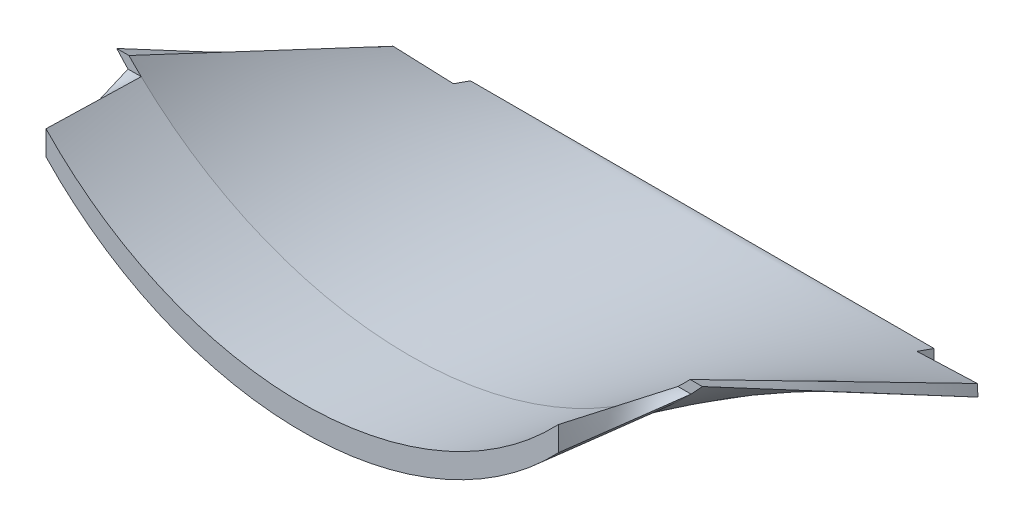
ISO-10303-21;
HEADER;
FILE_DESCRIPTION(('STEP AP214'),'2;1');
FILE_NAME('part.step','',(''),(''),'','','');
FILE_SCHEMA(('AUTOMOTIVE_DESIGN { 1 0 10303 214 1 1 1 1 }'));
ENDSEC;
DATA;
#1=APPLICATION_CONTEXT('core data for automotive mechanical design processes');
#2=APPLICATION_PROTOCOL_DEFINITION('international standard','automotive_design',2000,#1);
#3=PRODUCT_CONTEXT('',#1,'mechanical');
#4=PRODUCT('Part','Part','',(#3));
#5=PRODUCT_RELATED_PRODUCT_CATEGORY('part','',(#4));
#6=PRODUCT_DEFINITION_FORMATION('','',#4);
#7=PRODUCT_DEFINITION_CONTEXT('part definition',#1,'design');
#8=PRODUCT_DEFINITION('design','',#6,#7);
#9=PRODUCT_DEFINITION_SHAPE('','',#8);
#10=(LENGTH_UNIT() NAMED_UNIT(*) SI_UNIT(.MILLI.,.METRE.));
#11=(NAMED_UNIT(*) PLANE_ANGLE_UNIT() SI_UNIT($,.RADIAN.));
#12=(NAMED_UNIT(*) SI_UNIT($,.STERADIAN.) SOLID_ANGLE_UNIT());
#13=UNCERTAINTY_MEASURE_WITH_UNIT(LENGTH_MEASURE(1.E-05),#10,'distance_accuracy_value','');
#14=(GEOMETRIC_REPRESENTATION_CONTEXT(3) GLOBAL_UNCERTAINTY_ASSIGNED_CONTEXT((#13)) GLOBAL_UNIT_ASSIGNED_CONTEXT((#10,
#11,#12)) REPRESENTATION_CONTEXT('',''));
#15=CARTESIAN_POINT('',(0.,0.,0.));
#16=DIRECTION('',(0.,0.,1.));
#17=DIRECTION('',(1.,0.,0.));
#18=AXIS2_PLACEMENT_3D('',#15,#16,#17);
#19=CARTESIAN_POINT('',(0.,0.,0.));
#20=DIRECTION('',(0.,0.,-1.));
#21=DIRECTION('',(-1.,0.,0.));
#22=AXIS2_PLACEMENT_3D('',#19,#20,#21);
#23=PLANE('',#22);
#24=DIRECTION('',(0.,1.,0.));
#25=VECTOR('',#24,1.);
#26=CARTESIAN_POINT('',(215.,0.,0.));
#27=LINE('',#26,#25);
#28=CARTESIAN_POINT('',(215.,0.,0.));
#29=VERTEX_POINT('',#28);
#30=CARTESIAN_POINT('',(215.,5.,0.));
#31=VERTEX_POINT('',#30);
#32=EDGE_CURVE('E109',#29,#31,#27,.T.);
#33=ORIENTED_EDGE('',*,*,#32,.F.);
#34=DIRECTION('',(1.,0.,0.));
#35=VECTOR('',#34,1.);
#36=CARTESIAN_POINT('',(0.,0.,0.));
#37=LINE('',#36,#35);
#38=CARTESIAN_POINT('',(25.,0.,0.));
#39=VERTEX_POINT('',#38);
#40=EDGE_CURVE('E87',#39,#29,#37,.T.);
#41=ORIENTED_EDGE('',*,*,#40,.F.);
#42=DIRECTION('',(0.,1.,0.));
#43=VECTOR('',#42,1.);
#44=CARTESIAN_POINT('',(25.,0.,0.));
#45=LINE('',#44,#43);
#46=CARTESIAN_POINT('',(25.,5.,0.));
#47=VERTEX_POINT('',#46);
#48=EDGE_CURVE('E362',#39,#47,#45,.T.);
#49=ORIENTED_EDGE('',*,*,#48,.T.);
#50=DIRECTION('',(-1.,0.,0.));
#51=VECTOR('',#50,1.);
#52=CARTESIAN_POINT('',(0.,5.,0.));
#53=LINE('',#52,#51);
#54=EDGE_CURVE('E195',#31,#47,#53,.T.);
#55=ORIENTED_EDGE('',*,*,#54,.F.);
#56=EDGE_LOOP('',(#33,#41,#49,#55));
#57=FACE_BOUND('',#56,.T.);
#58=ADVANCED_FACE('F82',(#57),#23,.T.);
#59=CARTESIAN_POINT('',(0.,0.,0.));
#60=CARTESIAN_POINT('',(-2.35922392732846E-13,63.9999999999999,120.));
#61=CARTESIAN_POINT('',(4.99999999999999,0.,0.));
#62=CARTESIAN_POINT('',(3.31600831600808,60.2577962577961,120.));
#63=CARTESIAN_POINT('',(9.99999999999999,0.,0.));
#64=CARTESIAN_POINT('',(6.8775026291371,56.5916299291105,120.));
#65=CARTESIAN_POINT('',(20.,0.,0.));
#66=CARTESIAN_POINT('',(14.4935278419639,49.493526822893,120.));
#67=CARTESIAN_POINT('',(25.,0.,0.));
#68=CARTESIAN_POINT('',(18.548156125928,46.0617114329024,120.));
#69=CARTESIAN_POINT('',(35.,0.,0.));
#70=CARTESIAN_POINT('',(27.1356704977214,39.5199970816155,120.));
#71=CARTESIAN_POINT('',(40.,0.,0.));
#72=CARTESIAN_POINT('',(31.6686207080115,36.410259249401,120.));
#73=CARTESIAN_POINT('',(50.,0.,0.));
#74=CARTESIAN_POINT('',(41.1784381155174,30.6015054564811,120.));
#75=CARTESIAN_POINT('',(55.,0.,0.));
#76=CARTESIAN_POINT('',(46.1553188680852,27.9026796675301,120.));
#77=CARTESIAN_POINT('',(65.,0.,0.));
#78=CARTESIAN_POINT('',(56.4978637613016,23.0003542408574,120.));
#79=CARTESIAN_POINT('',(70.,0.,0.));
#80=CARTESIAN_POINT('',(61.8634777196454,20.7970549033918,120.));
#81=CARTESIAN_POINT('',(80.,0.,0.));
#82=CARTESIAN_POINT('',(72.9080669649224,16.9602469310869,120.));
#83=CARTESIAN_POINT('',(85.,0.,0.));
#84=CARTESIAN_POINT('',(78.5869235559504,15.326923576425,120.));
#85=CARTESIAN_POINT('',(94.9999999999999,0.,0.));
#86=CARTESIAN_POINT('',(90.1648122872831,12.6885061412107,120.));
#87=CARTESIAN_POINT('',(99.9999999999999,0.,0.));
#88=CARTESIAN_POINT('',(96.0636639089018,11.6835553094697,120.));
#89=CARTESIAN_POINT('',(110.,0.,0.));
#90=CARTESIAN_POINT('',(107.975119627564,10.3392631166036,120.));
#91=CARTESIAN_POINT('',(115.,0.,0.));
#92=CARTESIAN_POINT('',(113.9875,9.99999999999975,120.));
#93=CARTESIAN_POINT('',(125.,0.,0.));
#94=CARTESIAN_POINT('',(126.0125,9.99999999999973,120.));
#95=CARTESIAN_POINT('',(130.,0.,0.));
#96=CARTESIAN_POINT('',(132.024880372435,10.3392631166036,120.));
#97=CARTESIAN_POINT('',(140.,0.,0.));
#98=CARTESIAN_POINT('',(143.936336091098,11.6835553094696,120.));
#99=CARTESIAN_POINT('',(145.,0.,0.));
#100=CARTESIAN_POINT('',(149.835187712716,12.6885061412106,120.));
#101=CARTESIAN_POINT('',(155.,0.,0.));
#102=CARTESIAN_POINT('',(161.413076444049,15.3269235764249,120.));
#103=CARTESIAN_POINT('',(160.,0.,0.));
#104=CARTESIAN_POINT('',(167.091933035077,16.9602469310867,120.));
#105=CARTESIAN_POINT('',(170.,0.,0.));
#106=CARTESIAN_POINT('',(178.136522280354,20.7970549033916,120.));
#107=CARTESIAN_POINT('',(175.,0.,0.));
#108=CARTESIAN_POINT('',(183.502136238698,23.0003542408572,120.));
#109=CARTESIAN_POINT('',(185.,0.,0.));
#110=CARTESIAN_POINT('',(193.844681131914,27.9026796675298,120.));
#111=CARTESIAN_POINT('',(190.,0.,0.));
#112=CARTESIAN_POINT('',(198.821561884482,30.6015054564807,120.));
#113=CARTESIAN_POINT('',(200.,0.,0.));
#114=CARTESIAN_POINT('',(208.331379291988,36.4102592494006,120.));
#115=CARTESIAN_POINT('',(205.,0.,0.));
#116=CARTESIAN_POINT('',(212.864329502278,39.5199970816151,120.));
#117=CARTESIAN_POINT('',(215.,0.,0.));
#118=CARTESIAN_POINT('',(221.451843874072,46.0617114329019,120.));
#119=CARTESIAN_POINT('',(220.,0.,0.));
#120=CARTESIAN_POINT('',(225.506472158036,49.4935268228926,120.));
#121=CARTESIAN_POINT('',(230.,0.,0.));
#122=CARTESIAN_POINT('',(233.122497370863,56.59162992911,120.));
#123=CARTESIAN_POINT('',(235.,0.,0.));
#124=CARTESIAN_POINT('',(236.683991683992,60.2577962577957,120.));
#125=CARTESIAN_POINT('',(240.,0.,0.));
#126=CARTESIAN_POINT('',(240.,63.9999999999993,120.));
#127=B_SPLINE_SURFACE_WITH_KNOTS('',3,1,((#59,#60),(#61,#62),(#63,#64),(#65,#66),(#67,#68),(#69,
#70),(#71,#72),(#73,#74),(#75,#76),(#77,#78),(#79,#80),(#81,#82),(#83,#84),(#85,#86),(#87,#88),
(#89,#90),(#91,#92),(#93,#94),(#95,#96),(#97,#98),(#99,#100),(#101,#102),(#103,#104),(#105,
#106),(#107,#108),(#109,#110),(#111,#112),(#113,#114),(#115,#116),(#117,#118),(#119,#120),(#121,
#122),(#123,#124),(#125,#126)),.UNSPECIFIED.,.F.,.F.,.F.,(4,2,2,2,2,2,2,2,2,2,2,2,2,2,2,2,4),(2,
2),(0.,0.0625,0.125,0.1875,0.25,0.3125,0.375,0.4375,0.5,0.5625,0.625,0.6875,0.75,0.8125,0.875,
0.9375,1.),(0.,1.),.UNSPECIFIED.);
#128=CARTESIAN_POINT('',(215.,2.67520819860244,6.99999999999998));
#129=CARTESIAN_POINT('',(215.,2.23149630932724,5.83250931424209));
#130=CARTESIAN_POINT('',(215.,1.78670634813944,4.66543063802982));
#131=CARTESIAN_POINT('',(215.,0.894970281938621,2.33209730469649));
#132=CARTESIAN_POINT('',(215.,0.448024176925611,1.16584264757544));
#133=CARTESIAN_POINT('',(215.,0.,0.));
#134=B_SPLINE_CURVE_WITH_KNOTS('',3,(#128,#129,#130,#131,#132,#133),.UNSPECIFIED.,.F.,.F.,(4,2,
4),(0.,3.74689160697045,7.49378321394089),.UNSPECIFIED.);
#135=CARTESIAN_POINT('',(215.,2.67520819860245,6.99999999999998));
#136=VERTEX_POINT('',#135);
#137=EDGE_CURVE('E284',#136,#29,#134,.T.);
#138=CARTESIAN_POINT('',(215.,2.67520819860244,6.99999999999998));
#139=CARTESIAN_POINT('',(216.389043235331,2.73030400650115,6.99999999999998));
#140=CARTESIAN_POINT('',(217.778057768324,2.78612056956316,6.99999999999998));
#141=CARTESIAN_POINT('',(220.556030595476,2.89908847956591,6.99999999999998));
#142=CARTESIAN_POINT('',(221.944988889712,2.95623982461064,6.99999999999998));
#143=CARTESIAN_POINT('',(224.722853560185,3.07177069635616,6.99999999999998));
#144=CARTESIAN_POINT('',(226.111759936451,3.13015022235755,6.99999999999998));
#145=CARTESIAN_POINT('',(228.889524801976,3.24803186350404,6.99999999999998));
#146=CARTESIAN_POINT('',(230.278383291242,3.30753397846738,6.99999999999998));
#147=CARTESIAN_POINT('',(233.056057133562,3.42755922049269,6.99999999999998));
#148=CARTESIAN_POINT('',(234.444872486583,3.48808234830135,6.99999999999998));
#149=CARTESIAN_POINT('',(237.222464621741,3.61004586135335,6.99999999999998));
#150=CARTESIAN_POINT('',(238.611241403829,3.67148624771344,6.99999999999998));
#151=CARTESIAN_POINT('',(240.,3.73333333333328,6.99999999999998));
#152=B_SPLINE_CURVE_WITH_KNOTS('',3,(#138,#139,#140,#141,#142,#143,#144,#145,#146,#147,#148,
#149,#150,#151),.UNSPECIFIED.,.F.,.F.,(4,2,2,2,2,2,4),(0.,4.17040609274804,8.34080626191555,
12.5112040562028,16.6816011752179,20.8520013443093,25.0224065912985),.UNSPECIFIED.);
#153=CARTESIAN_POINT('',(240.,3.73333333333327,6.99999999999998));
#154=VERTEX_POINT('',#153);
#155=EDGE_CURVE('E358',#136,#154,#152,.T.);
#156=DIRECTION('',(0.,0.470588235294114,0.882352941176473));
#157=VECTOR('',#156,1.);
#158=CARTESIAN_POINT('',(240.,31.9999999999997,60.));
#159=LINE('',#158,#157);
#160=CARTESIAN_POINT('',(240.,63.9999999999993,120.));
#161=VERTEX_POINT('',#160);
#162=EDGE_CURVE('E301',#154,#161,#159,.T.);
#163=CARTESIAN_POINT('',(120.,170.333333333333,120.));
#164=DIRECTION('',(0.,0.,1.));
#165=DIRECTION('',(1.,0.,0.));
#166=AXIS2_PLACEMENT_3D('',#163,#164,#165);
#167=CIRCLE('',#166,160.333333333334);
#168=CARTESIAN_POINT('',(235.37628351178,59.000016633596,120.));
#169=VERTEX_POINT('',#168);
#170=EDGE_CURVE('E320',#169,#161,#167,.T.);
#171=CARTESIAN_POINT('',(120.,170.333333333334,120.));
#172=DIRECTION('',(0.,0.,1.));
#173=DIRECTION('',(1.,0.,0.));
#174=AXIS2_PLACEMENT_3D('',#171,#172,#173);
#175=CIRCLE('',#174,160.333333333334);
#176=CARTESIAN_POINT('',(4.6237243087702,59.0000166333746,120.));
#177=VERTEX_POINT('',#176);
#178=EDGE_CURVE('E406',#177,#169,#175,.T.);
#179=CARTESIAN_POINT('',(0.,64.,120.));
#180=VERTEX_POINT('',#179);
#181=EDGE_CURVE('E368',#180,#177,#167,.T.);
#182=DIRECTION('',(0.,-0.470588235294117,-0.882352941176471));
#183=VECTOR('',#182,1.);
#184=CARTESIAN_POINT('',(-1.17961196366423E-13,31.9999999999999,60.));
#185=LINE('',#184,#183);
#186=CARTESIAN_POINT('',(0.,3.73333333333335,7.));
#187=VERTEX_POINT('',#186);
#188=EDGE_CURVE('E305',#180,#187,#185,.T.);
#189=CARTESIAN_POINT('',(25.,2.67520819860247,7.));
#190=CARTESIAN_POINT('',(23.6109567646686,2.73030400650119,7.));
#191=CARTESIAN_POINT('',(22.2219422316759,2.7861205695632,7.));
#192=CARTESIAN_POINT('',(19.4439694045239,2.89908847956595,7.));
#193=CARTESIAN_POINT('',(18.0550111102877,2.95623982461067,7.));
#194=CARTESIAN_POINT('',(15.2771464398149,3.0717706963562,7.));
#195=CARTESIAN_POINT('',(13.8882400635491,3.13015022235758,7.));
#196=CARTESIAN_POINT('',(11.1104751980243,3.24803186350408,7.));
#197=CARTESIAN_POINT('',(9.72161670875757,3.30753397846742,7.));
#198=CARTESIAN_POINT('',(6.94394286643771,3.42755922049273,7.));
#199=CARTESIAN_POINT('',(5.55512751341692,3.4880823483014,7.));
#200=CARTESIAN_POINT('',(2.7775353782589,3.61004586135339,7.));
#201=CARTESIAN_POINT('',(1.3887585961707,3.67148624771348,7.));
#202=CARTESIAN_POINT('',(0.,3.73333333333333,7.));
#203=B_SPLINE_CURVE_WITH_KNOTS('',3,(#189,#190,#191,#192,#193,#194,#195,#196,#197,#198,#199,
#200,#201,#202),.UNSPECIFIED.,.F.,.F.,(4,2,2,2,2,2,4),(0.,4.17040609274806,8.34080626191559,
12.5112040562028,16.681601175218,20.8520013443094,25.0224065912986),.UNSPECIFIED.);
#204=CARTESIAN_POINT('',(25.,2.67520819860247,7.));
#205=VERTEX_POINT('',#204);
#206=EDGE_CURVE('E271',#205,#187,#203,.T.);
#207=CARTESIAN_POINT('',(25.,2.67520819860247,7.));
#208=CARTESIAN_POINT('',(25.,2.23149630932727,5.83250931424211));
#209=CARTESIAN_POINT('',(25.,1.78670634813946,4.66543063802984));
#210=CARTESIAN_POINT('',(25.,0.894970281938632,2.3320973046965));
#211=CARTESIAN_POINT('',(25.,0.448024176925617,1.16584264757544));
#212=CARTESIAN_POINT('',(25.,0.,0.));
#213=B_SPLINE_CURVE_WITH_KNOTS('',3,(#207,#208,#209,#210,#211,#212),.UNSPECIFIED.,.F.,.F.,(4,2,
4),(0.,3.74689160697046,7.49378321394093),.UNSPECIFIED.);
#214=EDGE_CURVE('E188',#205,#39,#213,.T.);
#215=ORIENTED_EDGE('',*,*,#137,.F.);
#216=ORIENTED_EDGE('',*,*,#155,.T.);
#217=ORIENTED_EDGE('',*,*,#162,.T.);
#218=ORIENTED_EDGE('',*,*,#170,.F.);
#219=ORIENTED_EDGE('',*,*,#178,.F.);
#220=ORIENTED_EDGE('',*,*,#181,.F.);
#221=ORIENTED_EDGE('',*,*,#188,.T.);
#222=ORIENTED_EDGE('',*,*,#206,.F.);
#223=ORIENTED_EDGE('',*,*,#214,.T.);
#224=ORIENTED_EDGE('',*,*,#40,.T.);
#225=EDGE_LOOP('',(#215,#216,#217,#218,#219,#220,#221,#222,#223,#224));
#226=FACE_BOUND('',#225,.T.);
#227=ADVANCED_FACE('F235',(#226),#127,.T.);
#228=CARTESIAN_POINT('',(240.,0.,0.));
#229=CARTESIAN_POINT('',(240.,63.9999999999992,120.));
#230=CARTESIAN_POINT('',(240.,0.833333333333336,0.));
#231=CARTESIAN_POINT('',(239.166666666667,63.9999999999993,120.));
#232=CARTESIAN_POINT('',(240.,1.66666666666667,0.));
#233=CARTESIAN_POINT('',(238.333333333334,63.9999999999994,120.));
#234=CARTESIAN_POINT('',(240.,3.33333333333334,0.));
#235=CARTESIAN_POINT('',(236.666666666667,63.9999999999997,120.));
#236=CARTESIAN_POINT('',(240.,4.16666666666667,0.));
#237=CARTESIAN_POINT('',(235.833333333334,63.9999999999999,120.));
#238=CARTESIAN_POINT('',(240.,5.,0.));
#239=CARTESIAN_POINT('',(235.,64.,120.));
#240=B_SPLINE_SURFACE_WITH_KNOTS('',3,1,((#228,#229),(#230,#231),(#232,#233),(#234,#235),(#236,
#237),(#238,#239)),.UNSPECIFIED.,.F.,.F.,.F.,(4,2,4),(2,2),(0.,0.5,1.),(0.,1.),.UNSPECIFIED.);
#241=CARTESIAN_POINT('',(240.,3.73333333333327,6.99999999999998));
#242=CARTESIAN_POINT('',(239.97423817269,4.14920283133097,6.99999999999998));
#243=CARTESIAN_POINT('',(239.948476345381,4.56507232932867,6.99999999999998));
#244=CARTESIAN_POINT('',(239.896952690762,5.39681132532407,6.99999999999998));
#245=CARTESIAN_POINT('',(239.871190863452,5.81268082332177,6.99999999999998));
#246=CARTESIAN_POINT('',(239.799730468539,6.96625576976853,6.99999999999998));
#247=CARTESIAN_POINT('',(239.754031900936,7.7039612182176,6.99999999999998));
#248=CARTESIAN_POINT('',(239.708333333333,8.44166666666666,6.99999999999998));
#249=B_SPLINE_CURVE_WITH_KNOTS('',3,(#241,#242,#243,#244,#245,#246,#247,#248),.UNSPECIFIED.,.F.,
.F.,(4,2,2,4),(0.,1.25000000000028,2.50000000000056,4.71735860648973),.UNSPECIFIED.);
#250=CARTESIAN_POINT('',(239.708333333333,8.44166666666666,6.99999999999998));
#251=VERTEX_POINT('',#250);
#252=EDGE_CURVE('E285',#154,#251,#249,.T.);
#253=DIRECTION('',(-0.0373654927891956,0.440912814912508,0.896771826940694));
#254=VECTOR('',#253,1.);
#255=CARTESIAN_POINT('',(237.5,34.5,60.));
#256=LINE('',#255,#254);
#257=CARTESIAN_POINT('',(235.,64.,120.));
#258=VERTEX_POINT('',#257);
#259=EDGE_CURVE('E304',#251,#258,#256,.T.);
#260=DIRECTION('',(-1.,1.69309011255336E-13,0.));
#261=VECTOR('',#260,1.);
#262=CARTESIAN_POINT('',(240.,63.9999999999992,120.));
#263=LINE('',#262,#261);
#264=EDGE_CURVE('E398',#161,#258,#263,.T.);
#265=ORIENTED_EDGE('',*,*,#162,.F.);
#266=ORIENTED_EDGE('',*,*,#252,.T.);
#267=ORIENTED_EDGE('',*,*,#259,.T.);
#268=ORIENTED_EDGE('',*,*,#264,.F.);
#269=EDGE_LOOP('',(#265,#266,#267,#268));
#270=FACE_BOUND('',#269,.T.);
#271=ADVANCED_FACE('F242',(#270),#240,.T.);
#272=CARTESIAN_POINT('',(240.,5.,0.));
#273=CARTESIAN_POINT('',(235.,64.,120.));
#274=CARTESIAN_POINT('',(235.,5.,0.));
#275=CARTESIAN_POINT('',(231.680852425445,60.5440878450446,120.));
#276=CARTESIAN_POINT('',(230.,5.,0.));
#277=CARTESIAN_POINT('',(228.141623168644,57.1712151533164,120.));
#278=CARTESIAN_POINT('',(220.,5.,0.));
#279=CARTESIAN_POINT('',(220.626686325998,50.663056756099,120.));
#280=CARTESIAN_POINT('',(215.,5.,0.));
#281=CARTESIAN_POINT('',(216.650912735726,47.5278746802722,120.));
#282=CARTESIAN_POINT('',(205.,5.,0.));
#283=CARTESIAN_POINT('',(208.280886637369,41.5698959889559,120.));
#284=CARTESIAN_POINT('',(200.,5.,0.));
#285=CARTESIAN_POINT('',(203.886596396964,38.7472295733604,120.));
#286=CARTESIAN_POINT('',(190.,5.,0.));
#287=CARTESIAN_POINT('',(194.713618733907,33.4886972821433,120.));
#288=CARTESIAN_POINT('',(185.,5.,0.));
#289=CARTESIAN_POINT('',(189.934933060004,31.0529790921107,120.));
#290=CARTESIAN_POINT('',(175.,5.,0.));
#291=CARTESIAN_POINT('',(180.043909998892,26.6381657334802,120.));
#292=CARTESIAN_POINT('',(170.,5.,0.));
#293=CARTESIAN_POINT('',(174.931621572061,24.659221551655,120.));
#294=CARTESIAN_POINT('',(160.,5.,0.));
#295=CARTESIAN_POINT('',(164.440066970339,21.2186460741416,120.));
#296=CARTESIAN_POINT('',(155.,5.,0.));
#297=CARTESIAN_POINT('',(159.06089870723,19.7571513904078,120.));
#298=CARTESIAN_POINT('',(145.,5.,0.));
#299=CARTESIAN_POINT('',(148.115983643787,17.3986469469832,120.));
#300=CARTESIAN_POINT('',(140.,5.,0.));
#301=CARTESIAN_POINT('',(142.550377840813,16.5017411941574,120.));
#302=CARTESIAN_POINT('',(130.,5.,0.));
#303=CARTESIAN_POINT('',(131.323097803066,15.3023895738318,120.));
#304=CARTESIAN_POINT('',(125.,5.,0.));
#305=CARTESIAN_POINT('',(125.661594202899,15.,120.));
#306=CARTESIAN_POINT('',(115.,5.,0.));
#307=CARTESIAN_POINT('',(114.338405797101,15.,120.));
#308=CARTESIAN_POINT('',(110.,5.,0.));
#309=CARTESIAN_POINT('',(108.676902196934,15.3023895738318,120.));
#310=CARTESIAN_POINT('',(99.9999999999998,5.,0.));
#311=CARTESIAN_POINT('',(97.4496221591873,16.5017411941574,120.));
#312=CARTESIAN_POINT('',(94.9999999999998,5.,0.));
#313=CARTESIAN_POINT('',(91.8840163562127,17.3986469469832,120.));
#314=CARTESIAN_POINT('',(84.9999999999998,5.,0.));
#315=CARTESIAN_POINT('',(80.9391012927703,19.7571513904078,120.));
#316=CARTESIAN_POINT('',(79.9999999999998,5.,0.));
#317=CARTESIAN_POINT('',(75.559933029661,21.2186460741416,120.));
#318=CARTESIAN_POINT('',(69.9999999999998,5.,0.));
#319=CARTESIAN_POINT('',(65.0683784279391,24.659221551655,120.));
#320=CARTESIAN_POINT('',(64.9999999999998,5.,0.));
#321=CARTESIAN_POINT('',(59.9560900011085,26.6381657334802,120.));
#322=CARTESIAN_POINT('',(54.9999999999999,5.,0.));
#323=CARTESIAN_POINT('',(50.0650669399957,31.0529790921107,120.));
#324=CARTESIAN_POINT('',(49.9999999999999,5.,0.));
#325=CARTESIAN_POINT('',(45.2863812660926,33.4886972821433,120.));
#326=CARTESIAN_POINT('',(39.9999999999999,5.,0.));
#327=CARTESIAN_POINT('',(36.1134036030362,38.7472295733604,120.));
#328=CARTESIAN_POINT('',(34.9999999999999,5.,0.));
#329=CARTESIAN_POINT('',(31.7191133626315,41.5698959889559,120.));
#330=CARTESIAN_POINT('',(24.9999999999999,5.,0.));
#331=CARTESIAN_POINT('',(23.349087264274,47.5278746802722,120.));
#332=CARTESIAN_POINT('',(19.9999999999999,5.,0.));
#333=CARTESIAN_POINT('',(19.3733136740019,50.663056756099,120.));
#334=CARTESIAN_POINT('',(9.99999999999996,5.,0.));
#335=CARTESIAN_POINT('',(11.8583768313563,57.1712151533164,120.));
#336=CARTESIAN_POINT('',(4.99999999999998,5.,0.));
#337=CARTESIAN_POINT('',(8.31914757455525,60.5440878450446,120.));
#338=CARTESIAN_POINT('',(0.,5.,0.));
#339=CARTESIAN_POINT('',(5.00000000000002,64.,120.));
#340=B_SPLINE_SURFACE_WITH_KNOTS('',3,1,((#272,#273),(#274,#275),(#276,#277),(#278,#279),(#280,
#281),(#282,#283),(#284,#285),(#286,#287),(#288,#289),(#290,#291),(#292,#293),(#294,#295),(#296,
#297),(#298,#299),(#300,#301),(#302,#303),(#304,#305),(#306,#307),(#308,#309),(#310,#311),(#312,
#313),(#314,#315),(#316,#317),(#318,#319),(#320,#321),(#322,#323),(#324,#325),(#326,#327),(#328,
#329),(#330,#331),(#332,#333),(#334,#335),(#336,#337),(#338,#339)),.UNSPECIFIED.,.F.,.F.,.F.,(4,
2,2,2,2,2,2,2,2,2,2,2,2,2,2,2,4),(2,2),(0.,0.0625,0.125,0.1875,0.25,0.3125,0.375,0.4375,0.5,
0.5625,0.625,0.6875,0.75,0.8125,0.875,0.9375,1.),(0.,1.),.UNSPECIFIED.);
#341=CARTESIAN_POINT('',(239.708333333333,8.44166666666666,6.99999999999998));
#342=CARTESIAN_POINT('',(238.335767299496,8.38521917974203,6.99999999999998));
#343=CARTESIAN_POINT('',(236.96318390189,8.32919236409281,6.99999999999998));
#344=CARTESIAN_POINT('',(234.217981204992,8.21806690477216,6.99999999999998));
#345=CARTESIAN_POINT('',(232.845361905746,8.16296825997959,6.99999999999998));
#346=CARTESIAN_POINT('',(230.10008388652,8.05378587362858,6.99999999999998));
#347=CARTESIAN_POINT('',(228.727425166569,7.99970213135209,6.99999999999998));
#348=CARTESIAN_POINT('',(225.982064617092,7.89263481277204,6.99999999999998));
#349=CARTESIAN_POINT('',(224.609362787561,7.83965123661711,6.99999999999998));
#350=CARTESIAN_POINT('',(221.863912975401,7.73487181159781,6.99999999999998));
#351=CARTESIAN_POINT('',(220.491164992746,7.68307596341336,6.99999999999998));
#352=CARTESIAN_POINT('',(217.745619618439,7.58075967134925,6.99999999999998));
#353=CARTESIAN_POINT('',(216.372822226722,7.530239229226,6.99999999999998));
#354=CARTESIAN_POINT('',(215.,7.48040038447267,6.99999999999998));
#355=B_SPLINE_CURVE_WITH_KNOTS('',3,(#341,#342,#343,#344,#345,#346,#347,#348,#349,#350,#351,
#352,#353,#354),.UNSPECIFIED.,.F.,.F.,(4,2,2,2,2,2,4),(0.,4.12117880810802,8.24235263786531,
12.3635235517785,16.4846950224837,20.6058688522655,24.7270483571204),.UNSPECIFIED.);
#356=CARTESIAN_POINT('',(215.,7.48040038447267,6.99999999999998));
#357=VERTEX_POINT('',#356);
#358=EDGE_CURVE('E12',#251,#357,#355,.T.);
#359=CARTESIAN_POINT('',(215.,5.,0.));
#360=CARTESIAN_POINT('',(215.,5.41389863889865,1.16649000021311));
#361=CARTESIAN_POINT('',(215.,5.82754799038736,2.33306833365299));
#362=CARTESIAN_POINT('',(215.,6.65434811854492,4.66640166698632));
#363=CARTESIAN_POINT('',(215.,7.06749889521376,5.83315666687976));
#364=CARTESIAN_POINT('',(215.,7.48040038447267,6.99999999999998));
#365=B_SPLINE_CURVE_WITH_KNOTS('',3,(#359,#360,#361,#362,#363,#364),.UNSPECIFIED.,.F.,.F.,(4,2,
4),(0.,3.71323270834804,7.42646541669608),.UNSPECIFIED.);
#366=EDGE_CURVE('E93',#31,#357,#365,.T.);
#367=CARTESIAN_POINT('',(25.,5.,0.));
#368=CARTESIAN_POINT('',(25.,5.41389863889865,1.16649000021311));
#369=CARTESIAN_POINT('',(25.,5.82754799038736,2.333068333653));
#370=CARTESIAN_POINT('',(25.,6.65434811854492,4.66640166698633));
#371=CARTESIAN_POINT('',(25.,7.06749889521376,5.83315666687978));
#372=CARTESIAN_POINT('',(25.,7.48040038447267,7.));
#373=B_SPLINE_CURVE_WITH_KNOTS('',3,(#367,#368,#369,#370,#371,#372),.UNSPECIFIED.,.F.,.F.,(4,2,
4),(0.,3.71323270834805,7.4264654166961),.UNSPECIFIED.);
#374=CARTESIAN_POINT('',(25.,7.48040038447267,7.));
#375=VERTEX_POINT('',#374);
#376=EDGE_CURVE('E181',#47,#375,#373,.T.);
#377=CARTESIAN_POINT('',(0.291666666666668,8.44166666666667,7.));
#378=CARTESIAN_POINT('',(1.66423270050366,8.38521917974204,7.));
#379=CARTESIAN_POINT('',(3.03681609811027,8.32919236409282,7.));
#380=CARTESIAN_POINT('',(5.78201879500831,8.21806690477217,7.));
#381=CARTESIAN_POINT('',(7.15463809425438,8.1629682599796,7.));
#382=CARTESIAN_POINT('',(9.89991611348026,8.05378587362859,7.));
#383=CARTESIAN_POINT('',(11.2725748334315,7.9997021313521,7.));
#384=CARTESIAN_POINT('',(14.0179353829079,7.89263481277204,7.));
#385=CARTESIAN_POINT('',(15.3906372124389,7.83965123661711,7.));
#386=CARTESIAN_POINT('',(18.136087024599,7.73487181159782,7.));
#387=CARTESIAN_POINT('',(19.5088350072541,7.68307596341336,7.));
#388=CARTESIAN_POINT('',(22.2543803815607,7.58075967134926,7.));
#389=CARTESIAN_POINT('',(23.6271777732775,7.53023922922601,7.));
#390=CARTESIAN_POINT('',(25.,7.48040038447267,7.));
#391=B_SPLINE_CURVE_WITH_KNOTS('',3,(#377,#378,#379,#380,#381,#382,#383,#384,#385,#386,#387,
#388,#389,#390),.UNSPECIFIED.,.F.,.F.,(4,2,2,2,2,2,4),(0.,4.12117880810801,8.24235263786535,
12.3635235517785,16.4846950224837,20.6058688522655,24.7270483571205),.UNSPECIFIED.);
#392=CARTESIAN_POINT('',(0.291666666666668,8.44166666666667,7.));
#393=VERTEX_POINT('',#392);
#394=EDGE_CURVE('E173',#393,#375,#391,.T.);
#395=DIRECTION('',(0.0373654927891957,0.440912814912508,0.896771826940694));
#396=VECTOR('',#395,1.);
#397=CARTESIAN_POINT('',(2.50000000000001,34.5,60.));
#398=LINE('',#397,#396);
#399=CARTESIAN_POINT('',(5.,64.,120.));
#400=VERTEX_POINT('',#399);
#401=EDGE_CURVE('E318',#393,#400,#398,.T.);
#402=CARTESIAN_POINT('',(120.,174.448979591837,120.));
#403=DIRECTION('',(0.,0.,-1.));
#404=DIRECTION('',(1.,0.,0.));
#405=AXIS2_PLACEMENT_3D('',#402,#403,#404);
#406=CIRCLE('',#405,159.448979591837);
#407=CARTESIAN_POINT('',(10.0203316564655,59.0000167562355,120.));
#408=VERTEX_POINT('',#407);
#409=EDGE_CURVE('E395',#408,#400,#406,.T.);
#410=CARTESIAN_POINT('',(120.,174.448979591838,120.));
#411=DIRECTION('',(0.,0.,-1.));
#412=DIRECTION('',(1.,0.,0.));
#413=AXIS2_PLACEMENT_3D('',#410,#411,#412);
#414=CIRCLE('',#413,159.448979591838);
#415=CARTESIAN_POINT('',(229.979660384382,59.0000167561093,120.));
#416=VERTEX_POINT('',#415);
#417=EDGE_CURVE('E399',#416,#408,#414,.T.);
#418=EDGE_CURVE('E391',#258,#416,#406,.T.);
#419=ORIENTED_EDGE('',*,*,#259,.F.);
#420=ORIENTED_EDGE('',*,*,#358,.T.);
#421=ORIENTED_EDGE('',*,*,#366,.F.);
#422=ORIENTED_EDGE('',*,*,#54,.T.);
#423=ORIENTED_EDGE('',*,*,#376,.T.);
#424=ORIENTED_EDGE('',*,*,#394,.F.);
#425=ORIENTED_EDGE('',*,*,#401,.T.);
#426=ORIENTED_EDGE('',*,*,#409,.F.);
#427=ORIENTED_EDGE('',*,*,#417,.F.);
#428=ORIENTED_EDGE('',*,*,#418,.F.);
#429=EDGE_LOOP('',(#419,#420,#421,#422,#423,#424,#425,#426,#427,#428));
#430=FACE_BOUND('',#429,.T.);
#431=ADVANCED_FACE('F193',(#430),#340,.T.);
#432=CARTESIAN_POINT('',(120.,170.333333333333,120.));
#433=DIRECTION('',(0.,0.,1.));
#434=DIRECTION('',(1.,0.,0.));
#435=AXIS2_PLACEMENT_3D('',#432,#433,#434);
#436=PLANE('',#435);
#437=ORIENTED_EDGE('',*,*,#181,.T.);
#438=DIRECTION('',(-1.,0.,0.));
#439=VECTOR('',#438,1.);
#440=CARTESIAN_POINT('',(4.62380372595586,59.,120.));
#441=LINE('',#440,#439);
#442=EDGE_CURVE('E401',#408,#177,#441,.T.);
#443=ORIENTED_EDGE('',*,*,#442,.F.);
#444=ORIENTED_EDGE('',*,*,#409,.T.);
#445=DIRECTION('',(-1.,0.,0.));
#446=VECTOR('',#445,1.);
#447=CARTESIAN_POINT('',(0.,64.,120.));
#448=LINE('',#447,#446);
#449=EDGE_CURVE('E182',#400,#180,#448,.T.);
#450=ORIENTED_EDGE('',*,*,#449,.T.);
#451=EDGE_LOOP('',(#437,#443,#444,#450));
#452=FACE_BOUND('',#451,.T.);
#453=ADVANCED_FACE('F84',(#452),#436,.T.);
#454=ORIENTED_EDGE('',*,*,#418,.T.);
#455=DIRECTION('',(-1.,0.,0.));
#456=VECTOR('',#455,1.);
#457=CARTESIAN_POINT('',(235.376196274044,59.,120.));
#458=LINE('',#457,#456);
#459=EDGE_CURVE('E422',#169,#416,#458,.T.);
#460=ORIENTED_EDGE('',*,*,#459,.F.);
#461=ORIENTED_EDGE('',*,*,#170,.T.);
#462=ORIENTED_EDGE('',*,*,#264,.T.);
#463=EDGE_LOOP('',(#454,#460,#461,#462));
#464=FACE_BOUND('',#463,.T.);
#465=ADVANCED_FACE('F342',(#464),#436,.T.);
#466=CARTESIAN_POINT('',(0.,5.,0.));
#467=CARTESIAN_POINT('',(5.,64.,120.));
#468=CARTESIAN_POINT('',(0.,4.16666666666667,0.));
#469=CARTESIAN_POINT('',(4.16666666666667,64.,120.));
#470=CARTESIAN_POINT('',(0.,3.33333333333334,0.));
#471=CARTESIAN_POINT('',(3.33333333333334,64.,120.));
#472=CARTESIAN_POINT('',(0.,1.66666666666668,0.));
#473=CARTESIAN_POINT('',(1.66666666666667,64.,120.));
#474=CARTESIAN_POINT('',(0.,0.83333333333334,0.));
#475=CARTESIAN_POINT('',(0.833333333333336,64.,120.));
#476=CARTESIAN_POINT('',(0.,0.,0.));
#477=CARTESIAN_POINT('',(0.,64.,120.));
#478=B_SPLINE_SURFACE_WITH_KNOTS('',3,1,((#466,#467),(#468,#469),(#470,#471),(#472,#473),(#474,
#475),(#476,#477)),.UNSPECIFIED.,.F.,.F.,.F.,(4,2,4),(2,2),(0.,0.5,1.),(0.,1.),.UNSPECIFIED.);
#479=CARTESIAN_POINT('',(0.,3.73333333333335,7.));
#480=CARTESIAN_POINT('',(0.0257618273095873,4.14920283133096,7.));
#481=CARTESIAN_POINT('',(0.0515236546191736,4.56507232932857,7.));
#482=CARTESIAN_POINT('',(0.103047309238346,5.39681132532379,7.));
#483=CARTESIAN_POINT('',(0.128809136547933,5.8126808233214,7.));
#484=CARTESIAN_POINT('',(0.200269531460569,6.96625576976823,7.));
#485=CARTESIAN_POINT('',(0.245968099063618,7.70396121821745,7.));
#486=CARTESIAN_POINT('',(0.291666666666667,8.44166666666667,7.));
#487=B_SPLINE_CURVE_WITH_KNOTS('',3,(#479,#480,#481,#482,#483,#484,#485,#486),.UNSPECIFIED.,.F.,
.F.,(4,2,2,4),(0.,1.25000000000001,2.50000000000002,4.71735860648967),.UNSPECIFIED.);
#488=EDGE_CURVE('E101',#187,#393,#487,.T.);
#489=ORIENTED_EDGE('',*,*,#488,.F.);
#490=ORIENTED_EDGE('',*,*,#188,.F.);
#491=ORIENTED_EDGE('',*,*,#449,.F.);
#492=ORIENTED_EDGE('',*,*,#401,.F.);
#493=EDGE_LOOP('',(#489,#490,#491,#492));
#494=FACE_BOUND('',#493,.T.);
#495=ADVANCED_FACE('F331',(#494),#478,.T.);
#496=CARTESIAN_POINT('',(120.,155.,164.));
#497=DIRECTION('',(0.,0.,1.));
#498=DIRECTION('',(1.,0.,0.));
#499=AXIS2_PLACEMENT_3D('',#496,#497,#498);
#500=PLANE('',#499);
#501=CARTESIAN_POINT('',(120.,155.,164.));
#502=DIRECTION('',(0.,0.,1.));
#503=DIRECTION('',(1.,0.,0.));
#504=AXIS2_PLACEMENT_3D('',#501,#502,#503);
#505=CIRCLE('',#504,145.);
#506=CARTESIAN_POINT('',(15.,55.,164.));
#507=VERTEX_POINT('',#506);
#508=CARTESIAN_POINT('',(225.,55.0000000000001,164.));
#509=VERTEX_POINT('',#508);
#510=EDGE_CURVE('E548',#507,#509,#505,.T.);
#511=ORIENTED_EDGE('',*,*,#510,.T.);
#512=DIRECTION('',(0.,1.,0.));
#513=VECTOR('',#512,1.);
#514=CARTESIAN_POINT('',(225.,55.,164.));
#515=LINE('',#514,#513);
#516=CARTESIAN_POINT('',(225.,65.,164.));
#517=VERTEX_POINT('',#516);
#518=EDGE_CURVE('E747',#509,#517,#515,.T.);
#519=ORIENTED_EDGE('',*,*,#518,.T.);
#520=CARTESIAN_POINT('',(120.,165.,164.));
#521=DIRECTION('',(0.,0.,-1.));
#522=DIRECTION('',(1.,0.,0.));
#523=AXIS2_PLACEMENT_3D('',#520,#521,#522);
#524=CIRCLE('',#523,145.);
#525=CARTESIAN_POINT('',(15.,65.,164.));
#526=VERTEX_POINT('',#525);
#527=EDGE_CURVE('E370',#517,#526,#524,.T.);
#528=ORIENTED_EDGE('',*,*,#527,.T.);
#529=DIRECTION('',(0.,-1.,0.));
#530=VECTOR('',#529,1.);
#531=CARTESIAN_POINT('',(15.,55.,164.));
#532=LINE('',#531,#530);
#533=EDGE_CURVE('E369',#526,#507,#532,.T.);
#534=ORIENTED_EDGE('',*,*,#533,.T.);
#535=EDGE_LOOP('',(#511,#519,#528,#534));
#536=FACE_BOUND('',#535,.T.);
#537=ADVANCED_FACE('F341',(#536),#500,.T.);
#538=CARTESIAN_POINT('',(4.62380372595583,59.,120.));
#539=CARTESIAN_POINT('',(15.,55.,164.));
#540=CARTESIAN_POINT('',(7.96195770685766,55.5406271656272,120.));
#541=CARTESIAN_POINT('',(18.0172413793103,51.8318965517242,164.));
#542=CARTESIAN_POINT('',(11.5200062259159,52.1651142641013,120.));
#543=CARTESIAN_POINT('',(21.2368978366351,48.738707342573,164.));
#544=CARTESIAN_POINT('',(19.0718962832124,45.6531226848399,120.));
#545=CARTESIAN_POINT('',(28.0781706565155,42.7681419724956,164.));
#546=CARTESIAN_POINT('',(23.065802616873,42.5167471854451,120.));
#547=CARTESIAN_POINT('',(31.6998496441578,39.8908617060377,164.));
#548=CARTESIAN_POINT('',(31.4711590502486,36.5575409159263,120.));
#549=CARTESIAN_POINT('',(39.3290520899462,34.4212770222861,164.));
#550=CARTESIAN_POINT('',(35.8826458158674,33.7348393923152,120.));
#551=CARTESIAN_POINT('',(43.336611981901,31.8290937376869,164.));
#552=CARTESIAN_POINT('',(45.0889299833546,28.4770348800944,120.));
#553=CARTESIAN_POINT('',(51.706529940146,26.9986361046221,164.));
#554=CARTESIAN_POINT('',(49.8837249445704,26.0420781733377,120.));
#555=CARTESIAN_POINT('',(56.0688875669244,24.760499702558,164.));
#556=CARTESIAN_POINT('',(59.8058543737384,21.6291868692215,120.));
#557=CARTESIAN_POINT('',(65.1018441403926,20.7029149315884,164.));
#558=CARTESIAN_POINT('',(64.9331397720185,19.6514015743587,120.));
#559=CARTESIAN_POINT('',(69.7723983241423,18.8836080161259,164.));
#560=CARTESIAN_POINT('',(75.4536889557966,16.2131535179133,120.));
#561=CARTESIAN_POINT('',(79.3603340351986,15.7200599975515,164.));
#562=CARTESIAN_POINT('',(80.846855421422,14.7528256765263,120.));
#563=CARTESIAN_POINT('',(84.2776246761941,14.375947166967,164.));
#564=CARTESIAN_POINT('',(91.8190119839739,12.3963363770109,120.));
#565=CARTESIAN_POINT('',(94.2847965091779,12.2066505631718,164.));
#566=CARTESIAN_POINT('',(97.3978623519466,11.5002775486078,120.));
#567=CARTESIAN_POINT('',(99.3745461163024,11.3815646002311,164.));
#568=CARTESIAN_POINT('',(108.651224518834,10.3020816002629,120.));
#569=CARTESIAN_POINT('',(109.642941960009,10.2782128242523,164.));
#570=CARTESIAN_POINT('',(114.325567442964,9.9999999999998,120.));
#571=CARTESIAN_POINT('',(114.821428571429,10.,164.));
#572=CARTESIAN_POINT('',(125.674432557036,9.9999999999998,120.));
#573=CARTESIAN_POINT('',(125.178571428571,10.,164.));
#574=CARTESIAN_POINT('',(131.348775481166,10.3020816002629,120.));
#575=CARTESIAN_POINT('',(130.357058039991,10.2782128242523,164.));
#576=CARTESIAN_POINT('',(142.602137648053,11.5002775486078,120.));
#577=CARTESIAN_POINT('',(140.625453883698,11.3815646002311,164.));
#578=CARTESIAN_POINT('',(148.180988016026,12.3963363770109,120.));
#579=CARTESIAN_POINT('',(145.715203490822,12.2066505631718,164.));
#580=CARTESIAN_POINT('',(159.153144578578,14.7528256765263,120.));
#581=CARTESIAN_POINT('',(155.722375323806,14.375947166967,164.));
#582=CARTESIAN_POINT('',(164.546311044203,16.2131535179132,120.));
#583=CARTESIAN_POINT('',(160.639665964801,15.7200599975515,164.));
#584=CARTESIAN_POINT('',(175.066860227982,19.6514015743587,120.));
#585=CARTESIAN_POINT('',(170.227601675858,18.8836080161259,164.));
#586=CARTESIAN_POINT('',(180.194145626262,21.6291868692214,120.));
#587=CARTESIAN_POINT('',(174.898155859607,20.7029149315884,164.));
#588=CARTESIAN_POINT('',(190.11627505543,26.0420781733377,120.));
#589=CARTESIAN_POINT('',(183.931112433075,24.760499702558,164.));
#590=CARTESIAN_POINT('',(194.911070016645,28.4770348800943,120.));
#591=CARTESIAN_POINT('',(188.293470059854,26.9986361046221,164.));
#592=CARTESIAN_POINT('',(204.117354184133,33.7348393923152,120.));
#593=CARTESIAN_POINT('',(196.663388018099,31.8290937376868,164.));
#594=CARTESIAN_POINT('',(208.528840949751,36.5575409159263,120.));
#595=CARTESIAN_POINT('',(200.670947910054,34.4212770222861,164.));
#596=CARTESIAN_POINT('',(216.934197383127,42.5167471854451,120.));
#597=CARTESIAN_POINT('',(208.300150355842,39.8908617060377,164.));
#598=CARTESIAN_POINT('',(220.928103716788,45.6531226848399,120.));
#599=CARTESIAN_POINT('',(211.921829343484,42.7681419724955,164.));
#600=CARTESIAN_POINT('',(228.479993774084,52.1651142641013,120.));
#601=CARTESIAN_POINT('',(218.763102163365,48.738707342573,164.));
#602=CARTESIAN_POINT('',(232.038042293142,55.5406271656271,120.));
#603=CARTESIAN_POINT('',(221.98275862069,51.8318965517242,164.));
#604=CARTESIAN_POINT('',(235.376196274044,58.9999999999999,120.));
#605=CARTESIAN_POINT('',(225.,55.0000000000001,164.));
#606=B_SPLINE_SURFACE_WITH_KNOTS('',3,1,((#538,#539),(#540,#541),(#542,#543),(#544,#545),(#546,
#547),(#548,#549),(#550,#551),(#552,#553),(#554,#555),(#556,#557),(#558,#559),(#560,#561),(#562,
#563),(#564,#565),(#566,#567),(#568,#569),(#570,#571),(#572,#573),(#574,#575),(#576,#577),(#578,
#579),(#580,#581),(#582,#583),(#584,#585),(#586,#587),(#588,#589),(#590,#591),(#592,#593),(#594,
#595),(#596,#597),(#598,#599),(#600,#601),(#602,#603),(#604,#605)),.UNSPECIFIED.,.F.,.F.,.F.,(4,
2,2,2,2,2,2,2,2,2,2,2,2,2,2,2,4),(2,2),(0.,0.0624999999999999,0.125,0.1875,0.25,0.3125,0.375,
0.4375,0.5,0.5625,0.625,0.6875,0.75,0.8125,0.875,0.9375,1.),(0.,1.),.UNSPECIFIED.);
#607=DIRECTION('',(-0.22863348503394,-0.0881376870658677,0.969514557724593));
#608=VECTOR('',#607,1.);
#609=CARTESIAN_POINT('',(230.188098137022,57.,142.));
#610=LINE('',#609,#608);
#611=EDGE_CURVE('E575',#169,#509,#610,.T.);
#612=DIRECTION('',(-0.228633485033942,0.0881376870658715,-0.969514557724593));
#613=VECTOR('',#612,1.);
#614=CARTESIAN_POINT('',(9.8119018629779,57.,142.));
#615=LINE('',#614,#613);
#616=EDGE_CURVE('E405',#507,#177,#615,.T.);
#617=ORIENTED_EDGE('',*,*,#178,.T.);
#618=ORIENTED_EDGE('',*,*,#611,.T.);
#619=ORIENTED_EDGE('',*,*,#510,.F.);
#620=ORIENTED_EDGE('',*,*,#616,.T.);
#621=EDGE_LOOP('',(#617,#618,#619,#620));
#622=FACE_BOUND('',#621,.T.);
#623=ADVANCED_FACE('F553',(#622),#606,.T.);
#624=CARTESIAN_POINT('',(235.376196274044,59.,120.));
#625=CARTESIAN_POINT('',(225.,55.,164.));
#626=CARTESIAN_POINT('',(234.476761885575,59.,120.));
#627=CARTESIAN_POINT('',(225.,56.6666666666667,164.));
#628=CARTESIAN_POINT('',(233.577327497107,59.,120.));
#629=CARTESIAN_POINT('',(225.,58.3333333333333,164.));
#630=CARTESIAN_POINT('',(231.778458720169,59.,120.));
#631=CARTESIAN_POINT('',(225.,61.6666666666667,164.));
#632=CARTESIAN_POINT('',(230.879024331701,59.,120.));
#633=CARTESIAN_POINT('',(225.,63.3333333333333,164.));
#634=CARTESIAN_POINT('',(229.979589943233,59.,120.));
#635=CARTESIAN_POINT('',(225.,65.,164.));
#636=B_SPLINE_SURFACE_WITH_KNOTS('',3,1,((#624,#625),(#626,#627),(#628,#629),(#630,#631),(#632,
#633),(#634,#635)),.UNSPECIFIED.,.F.,.F.,.F.,(4,2,4),(2,2),(0.,0.5,1.),(0.,1.),.UNSPECIFIED.);
#637=DIRECTION('',(-0.111436303577475,0.13427166274474,0.984658860128091));
#638=VECTOR('',#637,1.);
#639=CARTESIAN_POINT('',(227.489794971616,62.,142.));
#640=LINE('',#639,#638);
#641=EDGE_CURVE('E582',#416,#517,#640,.T.);
#642=ORIENTED_EDGE('',*,*,#459,.T.);
#643=ORIENTED_EDGE('',*,*,#641,.T.);
#644=ORIENTED_EDGE('',*,*,#518,.F.);
#645=ORIENTED_EDGE('',*,*,#611,.F.);
#646=EDGE_LOOP('',(#642,#643,#644,#645));
#647=FACE_BOUND('',#646,.T.);
#648=ADVANCED_FACE('F518',(#647),#636,.T.);
#649=CARTESIAN_POINT('',(10.0204100567672,59.,120.));
#650=CARTESIAN_POINT('',(15.,65.,164.));
#651=CARTESIAN_POINT('',(9.12097566829866,59.,120.));
#652=CARTESIAN_POINT('',(15.,63.3333333333333,164.));
#653=CARTESIAN_POINT('',(8.2215412798301,59.,120.));
#654=CARTESIAN_POINT('',(15.,61.6666666666667,164.));
#655=CARTESIAN_POINT('',(6.42267250289298,59.,120.));
#656=CARTESIAN_POINT('',(15.,58.3333333333333,164.));
#657=CARTESIAN_POINT('',(5.52323811442442,59.,120.));
#658=CARTESIAN_POINT('',(15.,56.6666666666667,164.));
#659=CARTESIAN_POINT('',(4.62380372595586,59.,120.));
#660=CARTESIAN_POINT('',(15.,55.,164.));
#661=B_SPLINE_SURFACE_WITH_KNOTS('',3,1,((#649,#650),(#651,#652),(#653,#654),(#655,#656),(#657,
#658),(#659,#660)),.UNSPECIFIED.,.F.,.F.,.F.,(4,2,4),(2,2),(0.,0.5,1.),(0.,1.),.UNSPECIFIED.);
#662=DIRECTION('',(0.111436303577473,0.13427166274474,0.984658860128091));
#663=VECTOR('',#662,1.);
#664=CARTESIAN_POINT('',(12.5102050283836,62.,142.));
#665=LINE('',#664,#663);
#666=EDGE_CURVE('E505',#408,#526,#665,.T.);
#667=ORIENTED_EDGE('',*,*,#442,.T.);
#668=ORIENTED_EDGE('',*,*,#616,.F.);
#669=ORIENTED_EDGE('',*,*,#533,.F.);
#670=ORIENTED_EDGE('',*,*,#666,.F.);
#671=EDGE_LOOP('',(#667,#668,#669,#670));
#672=FACE_BOUND('',#671,.T.);
#673=ADVANCED_FACE('F507',(#672),#661,.T.);
#674=CARTESIAN_POINT('',(229.979589943233,58.9999999999999,120.));
#675=CARTESIAN_POINT('',(225.,65.,164.));
#676=CARTESIAN_POINT('',(226.661644743412,55.8392422884935,120.));
#677=CARTESIAN_POINT('',(221.98275862069,61.8318965517241,164.));
#678=CARTESIAN_POINT('',(223.149757475234,52.7668907190132,120.));
#679=CARTESIAN_POINT('',(218.763102163365,58.738707342573,164.));
#680=CARTESIAN_POINT('',(215.746415519061,46.8596887602599,120.));
#681=CARTESIAN_POINT('',(211.921829343484,52.7681419724955,164.));
#682=CARTESIAN_POINT('',(211.854920344712,44.0249228679202,120.));
#683=CARTESIAN_POINT('',(208.300150355842,49.8908617060376,164.));
#684=CARTESIAN_POINT('',(203.712436497802,38.6550587431542,120.));
#685=CARTESIAN_POINT('',(200.670947910054,44.4212770222861,164.));
#686=CARTESIAN_POINT('',(199.461429941093,36.120061231903,120.));
#687=CARTESIAN_POINT('',(196.663388018099,41.8290937376868,164.));
#688=CARTESIAN_POINT('',(190.632770583194,31.4104525347734,120.));
#689=CARTESIAN_POINT('',(188.293470059854,36.998636104622,164.));
#690=CARTESIAN_POINT('',(186.055129120688,29.2359511795447,120.));
#691=CARTESIAN_POINT('',(183.931112433075,34.760499702558,164.));
#692=CARTESIAN_POINT('',(176.618942722623,25.3034163698883,120.));
#693=CARTESIAN_POINT('',(174.898155859607,30.7029149315883,164.));
#694=CARTESIAN_POINT('',(171.760442325674,23.5454918696522,120.));
#695=CARTESIAN_POINT('',(170.227601675858,28.8836080161259,164.));
#696=CARTESIAN_POINT('',(161.820350380423,20.494232050465,120.));
#697=CARTESIAN_POINT('',(160.639665964801,25.7200599975515,164.));
#698=CARTESIAN_POINT('',(156.738836570663,19.2009931148882,120.));
#699=CARTESIAN_POINT('',(155.722375323806,24.375947166967,164.));
#700=CARTESIAN_POINT('',(146.420761086514,17.1161387691972,120.));
#701=CARTESIAN_POINT('',(145.715203490822,22.2066505631718,164.));
#702=CARTESIAN_POINT('',(141.184305641707,16.3245955900785,120.));
#703=CARTESIAN_POINT('',(140.625453883698,21.381564600231,164.));
#704=CARTESIAN_POINT('',(130.631838512491,15.266506840277,120.));
#705=CARTESIAN_POINT('',(130.357058039991,20.2782128242523,164.));
#706=CARTESIAN_POINT('',(125.315952339931,15.0000000000004,120.));
#707=CARTESIAN_POINT('',(125.178571428571,20.,164.));
#708=CARTESIAN_POINT('',(114.684047660069,15.0000000000004,120.));
#709=CARTESIAN_POINT('',(114.821428571428,20.,164.));
#710=CARTESIAN_POINT('',(109.368161487509,15.266506840277,120.));
#711=CARTESIAN_POINT('',(109.642941960009,20.2782128242523,164.));
#712=CARTESIAN_POINT('',(98.8156943582933,16.3245955900785,120.));
#713=CARTESIAN_POINT('',(99.3745461163024,21.381564600231,164.));
#714=CARTESIAN_POINT('',(93.5792389134861,17.1161387691972,120.));
#715=CARTESIAN_POINT('',(94.2847965091778,22.2066505631718,164.));
#716=CARTESIAN_POINT('',(83.261163429337,19.2009931148882,120.));
#717=CARTESIAN_POINT('',(84.277624676194,24.375947166967,164.));
#718=CARTESIAN_POINT('',(78.1796496195764,20.494232050465,120.));
#719=CARTESIAN_POINT('',(79.3603340351986,25.7200599975515,164.));
#720=CARTESIAN_POINT('',(68.239557674326,23.5454918696522,120.));
#721=CARTESIAN_POINT('',(69.7723983241423,28.8836080161259,164.));
#722=CARTESIAN_POINT('',(63.3810572773765,25.3034163698884,120.));
#723=CARTESIAN_POINT('',(65.1018441403926,30.7029149315884,164.));
#724=CARTESIAN_POINT('',(53.9448708793118,29.2359511795447,120.));
#725=CARTESIAN_POINT('',(56.0688875669244,34.760499702558,164.));
#726=CARTESIAN_POINT('',(49.3672294168058,31.4104525347735,120.));
#727=CARTESIAN_POINT('',(51.7065299401459,36.9986361046221,164.));
#728=CARTESIAN_POINT('',(40.5385700589073,36.1200612319031,120.));
#729=CARTESIAN_POINT('',(43.3366119819009,41.8290937376868,164.));
#730=CARTESIAN_POINT('',(36.2875635021977,38.6550587431543,120.));
#731=CARTESIAN_POINT('',(39.3290520899461,44.4212770222861,164.));
#732=CARTESIAN_POINT('',(28.1450796552877,44.0249228679202,120.));
#733=CARTESIAN_POINT('',(31.6998496441578,49.8908617060376,164.));
#734=CARTESIAN_POINT('',(24.2535844809393,46.85968876026,120.));
#735=CARTESIAN_POINT('',(28.0781706565155,52.7681419724955,164.));
#736=CARTESIAN_POINT('',(16.850242524766,52.7668907190132,120.));
#737=CARTESIAN_POINT('',(21.2368978366351,58.738707342573,164.));
#738=CARTESIAN_POINT('',(13.3383552565884,55.8392422884936,120.));
#739=CARTESIAN_POINT('',(18.0172413793103,61.8318965517242,164.));
#740=CARTESIAN_POINT('',(10.0204100567672,59.,120.));
#741=CARTESIAN_POINT('',(14.9999999999999,65.,164.));
#742=B_SPLINE_SURFACE_WITH_KNOTS('',3,1,((#674,#675),(#676,#677),(#678,#679),(#680,#681),(#682,
#683),(#684,#685),(#686,#687),(#688,#689),(#690,#691),(#692,#693),(#694,#695),(#696,#697),(#698,
#699),(#700,#701),(#702,#703),(#704,#705),(#706,#707),(#708,#709),(#710,#711),(#712,#713),(#714,
#715),(#716,#717),(#718,#719),(#720,#721),(#722,#723),(#724,#725),(#726,#727),(#728,#729),(#730,
#731),(#732,#733),(#734,#735),(#736,#737),(#738,#739),(#740,#741)),.UNSPECIFIED.,.F.,.F.,.F.,(4,
2,2,2,2,2,2,2,2,2,2,2,2,2,2,2,4),(2,2),(0.,0.0625,0.125,0.1875,0.25,0.3125,0.375,0.4375,0.5,
0.5625,0.625,0.6875,0.75,0.8125,0.875,0.9375,1.),(0.,1.),.UNSPECIFIED.);
#743=ORIENTED_EDGE('',*,*,#417,.T.);
#744=ORIENTED_EDGE('',*,*,#666,.T.);
#745=ORIENTED_EDGE('',*,*,#527,.F.);
#746=ORIENTED_EDGE('',*,*,#641,.F.);
#747=EDGE_LOOP('',(#743,#744,#745,#746));
#748=FACE_BOUND('',#747,.T.);
#749=ADVANCED_FACE('F218',(#748),#742,.T.);
#750=CARTESIAN_POINT('',(25.,65.0018377298217,7.));
#751=DIRECTION('',(-1.,0.,0.));
#752=DIRECTION('',(0.,0.,1.));
#753=AXIS2_PLACEMENT_3D('',#750,#751,#752);
#754=PLANE('',#753);
#755=DIRECTION('',(0.,-1.,0.));
#756=VECTOR('',#755,1.);
#757=CARTESIAN_POINT('',(25.,65.0018377298217,7.));
#758=LINE('',#757,#756);
#759=EDGE_CURVE('E176',#375,#205,#758,.T.);
#760=ORIENTED_EDGE('',*,*,#759,.F.);
#761=ORIENTED_EDGE('',*,*,#376,.F.);
#762=ORIENTED_EDGE('',*,*,#48,.F.);
#763=ORIENTED_EDGE('',*,*,#214,.F.);
#764=EDGE_LOOP('',(#760,#761,#762,#763));
#765=FACE_BOUND('',#764,.T.);
#766=ADVANCED_FACE('F185',(#765),#754,.T.);
#767=CARTESIAN_POINT('',(25.,65.0018377298217,7.));
#768=DIRECTION('',(0.,0.,1.));
#769=DIRECTION('',(1.,0.,0.));
#770=AXIS2_PLACEMENT_3D('',#767,#768,#769);
#771=PLANE('',#770);
#772=ORIENTED_EDGE('',*,*,#206,.T.);
#773=ORIENTED_EDGE('',*,*,#488,.T.);
#774=ORIENTED_EDGE('',*,*,#394,.T.);
#775=ORIENTED_EDGE('',*,*,#759,.T.);
#776=EDGE_LOOP('',(#772,#773,#774,#775));
#777=FACE_BOUND('',#776,.T.);
#778=ADVANCED_FACE('F175',(#777),#771,.F.);
#779=CARTESIAN_POINT('',(0.,65.0018377298217,6.99999999999998));
#780=DIRECTION('',(0.,0.,-1.));
#781=DIRECTION('',(-1.,0.,0.));
#782=AXIS2_PLACEMENT_3D('',#779,#780,#781);
#783=PLANE('',#782);
#784=DIRECTION('',(0.,-1.,0.));
#785=VECTOR('',#784,1.);
#786=CARTESIAN_POINT('',(215.,65.0018377298217,6.99999999999998));
#787=LINE('',#786,#785);
#788=EDGE_CURVE('E189',#357,#136,#787,.T.);
#789=ORIENTED_EDGE('',*,*,#788,.F.);
#790=ORIENTED_EDGE('',*,*,#358,.F.);
#791=ORIENTED_EDGE('',*,*,#252,.F.);
#792=ORIENTED_EDGE('',*,*,#155,.F.);
#793=EDGE_LOOP('',(#789,#790,#791,#792));
#794=FACE_BOUND('',#793,.T.);
#795=ADVANCED_FACE('F219',(#794),#783,.T.);
#796=CARTESIAN_POINT('',(215.,65.0018377298217,0.));
#797=DIRECTION('',(-1.,0.,0.));
#798=DIRECTION('',(0.,0.,1.));
#799=AXIS2_PLACEMENT_3D('',#796,#797,#798);
#800=PLANE('',#799);
#801=ORIENTED_EDGE('',*,*,#137,.T.);
#802=ORIENTED_EDGE('',*,*,#32,.T.);
#803=ORIENTED_EDGE('',*,*,#366,.T.);
#804=ORIENTED_EDGE('',*,*,#788,.T.);
#805=EDGE_LOOP('',(#801,#802,#803,#804));
#806=FACE_BOUND('',#805,.T.);
#807=ADVANCED_FACE('F289',(#806),#800,.F.);
#808=CLOSED_SHELL('',(#58,#227,#271,#431,#453,#465,#495,#537,#623,#648,#673,#749,#766,#778,#795,#807));
#809=MANIFOLD_SOLID_BREP('B2',#808);
#810=ADVANCED_BREP_SHAPE_REPRESENTATION('',(#18,#809),#14);
#811=SHAPE_DEFINITION_REPRESENTATION(#9,#810);
ENDSEC;
END-ISO-10303-21;
